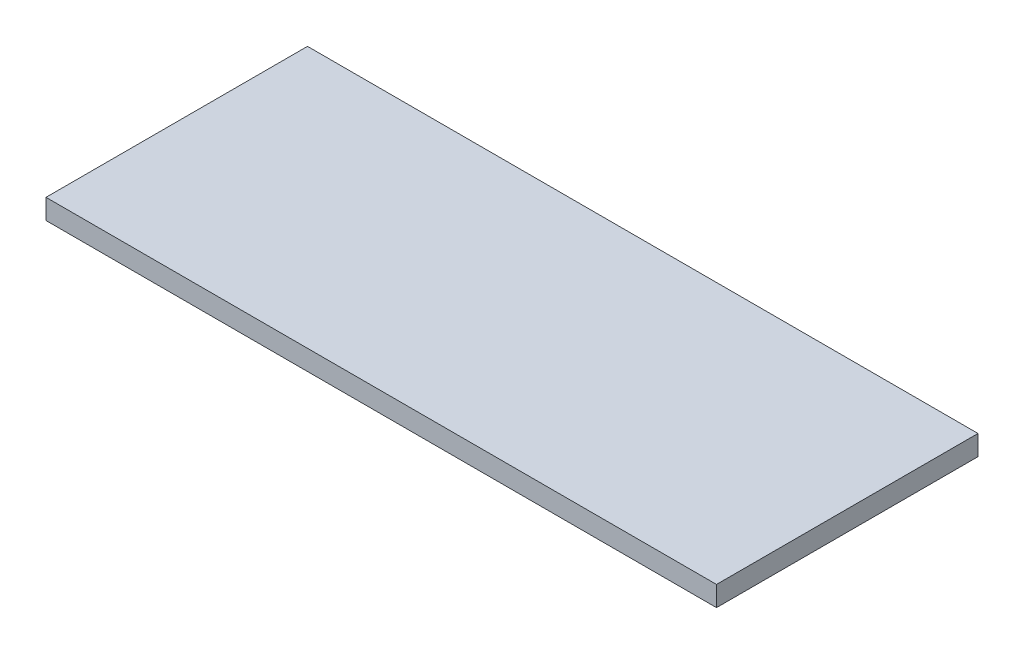
ISO-10303-21;
HEADER;
FILE_DESCRIPTION(('STEP AP214'),'2;1');
FILE_NAME('part.step','',(''),(''),'','','');
FILE_SCHEMA(('AUTOMOTIVE_DESIGN { 1 0 10303 214 1 1 1 1 }'));
ENDSEC;
DATA;
#1=APPLICATION_CONTEXT('core data for automotive mechanical design processes');
#2=APPLICATION_PROTOCOL_DEFINITION('international standard','automotive_design',2000,#1);
#3=PRODUCT_CONTEXT('',#1,'mechanical');
#4=PRODUCT('Part','Part','',(#3));
#5=PRODUCT_RELATED_PRODUCT_CATEGORY('part','',(#4));
#6=PRODUCT_DEFINITION_FORMATION('','',#4);
#7=PRODUCT_DEFINITION_CONTEXT('part definition',#1,'design');
#8=PRODUCT_DEFINITION('design','',#6,#7);
#9=PRODUCT_DEFINITION_SHAPE('','',#8);
#10=(LENGTH_UNIT() NAMED_UNIT(*) SI_UNIT(.MILLI.,.METRE.));
#11=(NAMED_UNIT(*) PLANE_ANGLE_UNIT() SI_UNIT($,.RADIAN.));
#12=(NAMED_UNIT(*) SI_UNIT($,.STERADIAN.) SOLID_ANGLE_UNIT());
#13=UNCERTAINTY_MEASURE_WITH_UNIT(LENGTH_MEASURE(1.E-05),#10,'distance_accuracy_value','');
#14=(GEOMETRIC_REPRESENTATION_CONTEXT(3) GLOBAL_UNCERTAINTY_ASSIGNED_CONTEXT((#13)) GLOBAL_UNIT_ASSIGNED_CONTEXT((#10,
#11,#12)) REPRESENTATION_CONTEXT('',''));
#15=CARTESIAN_POINT('',(0.,0.,0.));
#16=DIRECTION('',(0.,0.,1.));
#17=DIRECTION('',(1.,0.,0.));
#18=AXIS2_PLACEMENT_3D('',#15,#16,#17);
#19=CARTESIAN_POINT('',(-48.7972697474374,3.,-24.7217956005229));
#20=DIRECTION('',(0.,0.,-1.));
#21=DIRECTION('',(-1.,0.,0.));
#22=AXIS2_PLACEMENT_3D('',#19,#20,#21);
#23=PLANE('',#22);
#24=DIRECTION('',(1.,0.,0.));
#25=VECTOR('',#24,1.);
#26=CARTESIAN_POINT('',(-48.7972697474374,0.,-24.7217956005229));
#27=LINE('',#26,#25);
#28=CARTESIAN_POINT('',(-48.7972697474374,0.,-24.7217956005229));
#29=VERTEX_POINT('',#28);
#30=CARTESIAN_POINT('',(51.2027302525626,0.,-24.7217956005229));
#31=VERTEX_POINT('',#30);
#32=EDGE_CURVE('E100',#29,#31,#27,.T.);
#33=ORIENTED_EDGE('',*,*,#32,.F.);
#34=DIRECTION('',(0.,-1.,0.));
#35=VECTOR('',#34,1.);
#36=CARTESIAN_POINT('',(-48.7972697474374,3.,-24.7217956005229));
#37=LINE('',#36,#35);
#38=CARTESIAN_POINT('',(-48.7972697474374,3.,-24.7217956005229));
#39=VERTEX_POINT('',#38);
#40=EDGE_CURVE('E11',#39,#29,#37,.T.);
#41=ORIENTED_EDGE('',*,*,#40,.F.);
#42=DIRECTION('',(1.,0.,0.));
#43=VECTOR('',#42,1.);
#44=CARTESIAN_POINT('',(-48.7972697474374,3.,-24.7217956005229));
#45=LINE('',#44,#43);
#46=CARTESIAN_POINT('',(51.2027302525626,3.,-24.7217956005229));
#47=VERTEX_POINT('',#46);
#48=EDGE_CURVE('E95',#39,#47,#45,.T.);
#49=ORIENTED_EDGE('',*,*,#48,.T.);
#50=DIRECTION('',(0.,-1.,0.));
#51=VECTOR('',#50,1.);
#52=CARTESIAN_POINT('',(51.2027302525626,3.,-24.7217956005229));
#53=LINE('',#52,#51);
#54=EDGE_CURVE('E38',#47,#31,#53,.T.);
#55=ORIENTED_EDGE('',*,*,#54,.T.);
#56=EDGE_LOOP('',(#33,#41,#49,#55));
#57=FACE_BOUND('',#56,.T.);
#58=ADVANCED_FACE('F35',(#57),#23,.T.);
#59=CARTESIAN_POINT('',(-48.7972697474374,3.,-24.7217956005229));
#60=DIRECTION('',(1.,0.,0.));
#61=DIRECTION('',(0.,0.,-1.));
#62=AXIS2_PLACEMENT_3D('',#59,#60,#61);
#63=PLANE('',#62);
#64=DIRECTION('',(0.,0.,1.));
#65=VECTOR('',#64,1.);
#66=CARTESIAN_POINT('',(-48.7972697474374,0.,-24.7217956005229));
#67=LINE('',#66,#65);
#68=CARTESIAN_POINT('',(-48.7972697474374,0.,14.2782043994771));
#69=VERTEX_POINT('',#68);
#70=EDGE_CURVE('E68',#29,#69,#67,.T.);
#71=ORIENTED_EDGE('',*,*,#70,.T.);
#72=DIRECTION('',(0.,-1.,0.));
#73=VECTOR('',#72,1.);
#74=CARTESIAN_POINT('',(-48.7972697474374,3.,14.2782043994771));
#75=LINE('',#74,#73);
#76=CARTESIAN_POINT('',(-48.7972697474374,3.,14.2782043994771));
#77=VERTEX_POINT('',#76);
#78=EDGE_CURVE('E44',#77,#69,#75,.T.);
#79=ORIENTED_EDGE('',*,*,#78,.F.);
#80=DIRECTION('',(0.,0.,1.));
#81=VECTOR('',#80,1.);
#82=CARTESIAN_POINT('',(-48.7972697474374,3.,-24.7217956005229));
#83=LINE('',#82,#81);
#84=EDGE_CURVE('E85',#39,#77,#83,.T.);
#85=ORIENTED_EDGE('',*,*,#84,.F.);
#86=ORIENTED_EDGE('',*,*,#40,.T.);
#87=EDGE_LOOP('',(#71,#79,#85,#86));
#88=FACE_BOUND('',#87,.T.);
#89=ADVANCED_FACE('F110',(#88),#63,.F.);
#90=CARTESIAN_POINT('',(-48.7972697474374,3.,14.2782043994771));
#91=DIRECTION('',(0.,0.,-1.));
#92=DIRECTION('',(-1.,0.,0.));
#93=AXIS2_PLACEMENT_3D('',#90,#91,#92);
#94=PLANE('',#93);
#95=DIRECTION('',(1.,0.,0.));
#96=VECTOR('',#95,1.);
#97=CARTESIAN_POINT('',(-48.7972697474374,0.,14.2782043994771));
#98=LINE('',#97,#96);
#99=CARTESIAN_POINT('',(51.2027302525626,0.,14.2782043994771));
#100=VERTEX_POINT('',#99);
#101=EDGE_CURVE('E92',#69,#100,#98,.T.);
#102=ORIENTED_EDGE('',*,*,#101,.T.);
#103=DIRECTION('',(0.,-1.,0.));
#104=VECTOR('',#103,1.);
#105=CARTESIAN_POINT('',(51.2027302525626,3.,14.2782043994771));
#106=LINE('',#105,#104);
#107=CARTESIAN_POINT('',(51.2027302525626,3.,14.2782043994771));
#108=VERTEX_POINT('',#107);
#109=EDGE_CURVE('E89',#108,#100,#106,.T.);
#110=ORIENTED_EDGE('',*,*,#109,.F.);
#111=DIRECTION('',(1.,0.,0.));
#112=VECTOR('',#111,1.);
#113=CARTESIAN_POINT('',(-48.7972697474374,3.,14.2782043994771));
#114=LINE('',#113,#112);
#115=EDGE_CURVE('E80',#77,#108,#114,.T.);
#116=ORIENTED_EDGE('',*,*,#115,.F.);
#117=ORIENTED_EDGE('',*,*,#78,.T.);
#118=EDGE_LOOP('',(#102,#110,#116,#117));
#119=FACE_BOUND('',#118,.T.);
#120=ADVANCED_FACE('F90',(#119),#94,.F.);
#121=CARTESIAN_POINT('',(51.2027302525626,3.,-24.7217956005229));
#122=DIRECTION('',(1.,0.,0.));
#123=DIRECTION('',(0.,0.,-1.));
#124=AXIS2_PLACEMENT_3D('',#121,#122,#123);
#125=PLANE('',#124);
#126=DIRECTION('',(0.,0.,1.));
#127=VECTOR('',#126,1.);
#128=CARTESIAN_POINT('',(51.2027302525626,0.,-24.7217956005229));
#129=LINE('',#128,#127);
#130=EDGE_CURVE('E103',#31,#100,#129,.T.);
#131=ORIENTED_EDGE('',*,*,#130,.F.);
#132=ORIENTED_EDGE('',*,*,#54,.F.);
#133=DIRECTION('',(0.,0.,1.));
#134=VECTOR('',#133,1.);
#135=CARTESIAN_POINT('',(51.2027302525626,3.,-24.7217956005229));
#136=LINE('',#135,#134);
#137=EDGE_CURVE('E84',#47,#108,#136,.T.);
#138=ORIENTED_EDGE('',*,*,#137,.T.);
#139=ORIENTED_EDGE('',*,*,#109,.T.);
#140=EDGE_LOOP('',(#131,#132,#138,#139));
#141=FACE_BOUND('',#140,.T.);
#142=ADVANCED_FACE('F94',(#141),#125,.T.);
#143=CARTESIAN_POINT('',(0.,3.,0.));
#144=DIRECTION('',(0.,-1.,0.));
#145=DIRECTION('',(0.,0.,-1.));
#146=AXIS2_PLACEMENT_3D('',#143,#144,#145);
#147=PLANE('',#146);
#148=ORIENTED_EDGE('',*,*,#48,.F.);
#149=ORIENTED_EDGE('',*,*,#84,.T.);
#150=ORIENTED_EDGE('',*,*,#115,.T.);
#151=ORIENTED_EDGE('',*,*,#137,.F.);
#152=EDGE_LOOP('',(#148,#149,#150,#151));
#153=FACE_BOUND('',#152,.T.);
#154=ADVANCED_FACE('F83',(#153),#147,.F.);
#155=CARTESIAN_POINT('',(0.,0.,0.));
#156=DIRECTION('',(0.,-1.,0.));
#157=DIRECTION('',(0.,0.,-1.));
#158=AXIS2_PLACEMENT_3D('',#155,#156,#157);
#159=PLANE('',#158);
#160=ORIENTED_EDGE('',*,*,#32,.T.);
#161=ORIENTED_EDGE('',*,*,#130,.T.);
#162=ORIENTED_EDGE('',*,*,#101,.F.);
#163=ORIENTED_EDGE('',*,*,#70,.F.);
#164=EDGE_LOOP('',(#160,#161,#162,#163));
#165=FACE_BOUND('',#164,.T.);
#166=ADVANCED_FACE('F108',(#165),#159,.T.);
#167=CLOSED_SHELL('',(#58,#89,#120,#142,#154,#166));
#168=MANIFOLD_SOLID_BREP('B2',#167);
#169=ADVANCED_BREP_SHAPE_REPRESENTATION('',(#18,#168),#14);
#170=SHAPE_DEFINITION_REPRESENTATION(#9,#169);
ENDSEC;
END-ISO-10303-21;
